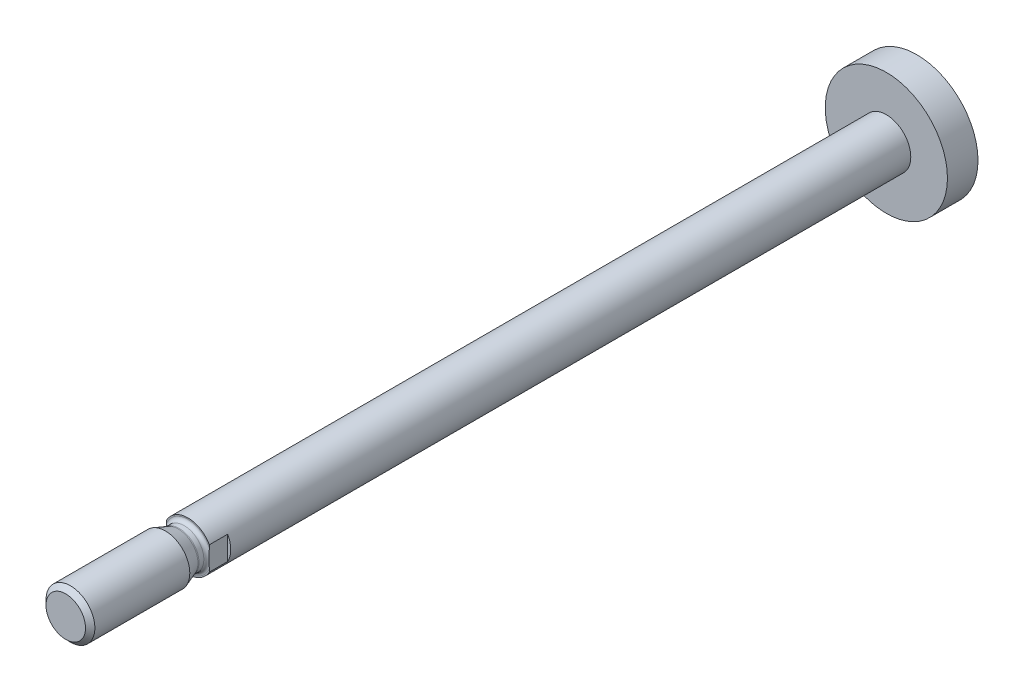
ISO-10303-21;
HEADER;
FILE_DESCRIPTION(('STEP AP214'),'2;1');
FILE_NAME('part.step','',(''),(''),'','','');
FILE_SCHEMA(('AUTOMOTIVE_DESIGN { 1 0 10303 214 1 1 1 1 }'));
ENDSEC;
DATA;
#1=APPLICATION_CONTEXT('core data for automotive mechanical design processes');
#2=APPLICATION_PROTOCOL_DEFINITION('international standard','automotive_design',2000,#1);
#3=PRODUCT_CONTEXT('',#1,'mechanical');
#4=PRODUCT('Part','Part','',(#3));
#5=PRODUCT_RELATED_PRODUCT_CATEGORY('part','',(#4));
#6=PRODUCT_DEFINITION_FORMATION('','',#4);
#7=PRODUCT_DEFINITION_CONTEXT('part definition',#1,'design');
#8=PRODUCT_DEFINITION('design','',#6,#7);
#9=PRODUCT_DEFINITION_SHAPE('','',#8);
#10=(LENGTH_UNIT() NAMED_UNIT(*) SI_UNIT(.MILLI.,.METRE.));
#11=(NAMED_UNIT(*) PLANE_ANGLE_UNIT() SI_UNIT($,.RADIAN.));
#12=(NAMED_UNIT(*) SI_UNIT($,.STERADIAN.) SOLID_ANGLE_UNIT());
#13=UNCERTAINTY_MEASURE_WITH_UNIT(LENGTH_MEASURE(1.E-05),#10,'distance_accuracy_value','');
#14=(GEOMETRIC_REPRESENTATION_CONTEXT(3) GLOBAL_UNCERTAINTY_ASSIGNED_CONTEXT((#13)) GLOBAL_UNIT_ASSIGNED_CONTEXT((#10,
#11,#12)) REPRESENTATION_CONTEXT('',''));
#15=CARTESIAN_POINT('',(0.,0.,0.));
#16=DIRECTION('',(0.,0.,1.));
#17=DIRECTION('',(1.,0.,0.));
#18=AXIS2_PLACEMENT_3D('',#15,#16,#17);
#19=CARTESIAN_POINT('',(0.,0.,4.));
#20=DIRECTION('',(0.,0.,-1.));
#21=DIRECTION('',(-1.,0.,0.));
#22=AXIS2_PLACEMENT_3D('',#19,#20,#21);
#23=PLANE('',#22);
#24=DIRECTION('',(0.,1.,0.));
#25=VECTOR('',#24,1.);
#26=CARTESIAN_POINT('',(-3.5,0.,4.));
#27=LINE('',#26,#25);
#28=CARTESIAN_POINT('',(-3.5,-1.93649167310371,4.));
#29=VERTEX_POINT('',#28);
#30=CARTESIAN_POINT('',(-3.5,-1.47986485869513,4.));
#31=VERTEX_POINT('',#30);
#32=EDGE_CURVE('E54',#29,#31,#27,.T.);
#33=ORIENTED_EDGE('',*,*,#32,.F.);
#34=CARTESIAN_POINT('',(0.,0.,4.));
#35=DIRECTION('',(0.,0.,1.));
#36=DIRECTION('',(1.,0.,0.));
#37=AXIS2_PLACEMENT_3D('',#34,#35,#36);
#38=CIRCLE('',#37,4.);
#39=CARTESIAN_POINT('',(3.5,-1.93649167310371,4.));
#40=VERTEX_POINT('',#39);
#41=EDGE_CURVE('E147',#29,#40,#38,.T.);
#42=ORIENTED_EDGE('',*,*,#41,.T.);
#43=DIRECTION('',(0.,-1.,0.));
#44=VECTOR('',#43,1.);
#45=CARTESIAN_POINT('',(3.5,0.,4.));
#46=LINE('',#45,#44);
#47=CARTESIAN_POINT('',(3.5,-1.47986485869513,3.99999999999992));
#48=VERTEX_POINT('',#47);
#49=EDGE_CURVE('E101',#48,#40,#46,.T.);
#50=ORIENTED_EDGE('',*,*,#49,.F.);
#51=CARTESIAN_POINT('',(0.,0.,4.));
#52=DIRECTION('',(0.,0.,1.));
#53=DIRECTION('',(1.,0.,0.));
#54=AXIS2_PLACEMENT_3D('',#51,#52,#53);
#55=CIRCLE('',#54,3.8000000000001);
#56=EDGE_CURVE('E149',#31,#48,#55,.T.);
#57=ORIENTED_EDGE('',*,*,#56,.F.);
#58=EDGE_LOOP('',(#33,#42,#50,#57));
#59=FACE_BOUND('',#58,.T.);
#60=ADVANCED_FACE('F40',(#59),#23,.F.);
#61=CARTESIAN_POINT('',(-3.5,1.47986485869513,3.99999999999992));
#62=VERTEX_POINT('',#61);
#63=CARTESIAN_POINT('',(-3.5,1.93649167310371,4.));
#64=VERTEX_POINT('',#63);
#65=EDGE_CURVE('E110',#62,#64,#27,.T.);
#66=ORIENTED_EDGE('',*,*,#65,.F.);
#67=CARTESIAN_POINT('',(3.5,1.47986485869513,4.));
#68=VERTEX_POINT('',#67);
#69=EDGE_CURVE('E150',#68,#62,#55,.T.);
#70=ORIENTED_EDGE('',*,*,#69,.F.);
#71=CARTESIAN_POINT('',(3.5,1.93649167310371,4.));
#72=VERTEX_POINT('',#71);
#73=EDGE_CURVE('E62',#72,#68,#46,.T.);
#74=ORIENTED_EDGE('',*,*,#73,.F.);
#75=EDGE_CURVE('E109',#72,#64,#38,.T.);
#76=ORIENTED_EDGE('',*,*,#75,.T.);
#77=EDGE_LOOP('',(#66,#70,#74,#76));
#78=FACE_BOUND('',#77,.T.);
#79=ADVANCED_FACE('F206',(#78),#23,.F.);
#80=CARTESIAN_POINT('',(0.,0.,-115.3));
#81=DIRECTION('',(0.,0.,1.));
#82=DIRECTION('',(1.,0.,0.));
#83=AXIS2_PLACEMENT_3D('',#80,#81,#82);
#84=CYLINDRICAL_SURFACE('',#83,4.);
#85=CARTESIAN_POINT('',(0.,0.,-110.3));
#86=DIRECTION('',(0.,0.,1.));
#87=DIRECTION('',(1.,0.,0.));
#88=AXIS2_PLACEMENT_3D('',#85,#86,#87);
#89=CIRCLE('',#88,4.);
#90=CARTESIAN_POINT('',(4.,0.,-110.3));
#91=VERTEX_POINT('',#90);
#92=EDGE_CURVE('E144',#91,#91,#89,.T.);
#93=ORIENTED_EDGE('',*,*,#92,.T.);
#94=EDGE_LOOP('',(#93));
#95=FACE_BOUND('',#94,.T.);
#96=DIRECTION('',(0.,0.,1.));
#97=VECTOR('',#96,1.);
#98=CARTESIAN_POINT('',(-3.5,-1.93649167310371,-115.3));
#99=LINE('',#98,#97);
#100=CARTESIAN_POINT('',(-3.5,-1.93649167310371,1.));
#101=VERTEX_POINT('',#100);
#102=EDGE_CURVE('E118',#101,#29,#99,.T.);
#103=ORIENTED_EDGE('',*,*,#102,.F.);
#104=CARTESIAN_POINT('',(0.,0.,1.));
#105=DIRECTION('',(0.,0.,1.));
#106=DIRECTION('',(1.,0.,0.));
#107=AXIS2_PLACEMENT_3D('',#104,#105,#106);
#108=CIRCLE('',#107,4.);
#109=CARTESIAN_POINT('',(-3.5,1.93649167310371,1.));
#110=VERTEX_POINT('',#109);
#111=EDGE_CURVE('E11',#110,#101,#108,.T.);
#112=ORIENTED_EDGE('',*,*,#111,.F.);
#113=DIRECTION('',(0.,0.,1.));
#114=VECTOR('',#113,1.);
#115=CARTESIAN_POINT('',(-3.5,1.93649167310371,-115.3));
#116=LINE('',#115,#114);
#117=EDGE_CURVE('E116',#64,#110,#116,.F.);
#118=ORIENTED_EDGE('',*,*,#117,.F.);
#119=ORIENTED_EDGE('',*,*,#75,.F.);
#120=DIRECTION('',(0.,0.,1.));
#121=VECTOR('',#120,1.);
#122=CARTESIAN_POINT('',(3.5,1.93649167310371,-115.3));
#123=LINE('',#122,#121);
#124=CARTESIAN_POINT('',(3.5,1.93649167310371,1.));
#125=VERTEX_POINT('',#124);
#126=EDGE_CURVE('E99',#125,#72,#123,.T.);
#127=ORIENTED_EDGE('',*,*,#126,.F.);
#128=CARTESIAN_POINT('',(3.5,-1.93649167310371,1.));
#129=VERTEX_POINT('',#128);
#130=EDGE_CURVE('E43',#129,#125,#108,.T.);
#131=ORIENTED_EDGE('',*,*,#130,.F.);
#132=DIRECTION('',(0.,0.,1.));
#133=VECTOR('',#132,1.);
#134=CARTESIAN_POINT('',(3.5,-1.93649167310371,-115.3));
#135=LINE('',#134,#133);
#136=EDGE_CURVE('E100',#40,#129,#135,.F.);
#137=ORIENTED_EDGE('',*,*,#136,.F.);
#138=ORIENTED_EDGE('',*,*,#41,.F.);
#139=EDGE_LOOP('',(#103,#112,#118,#119,#127,#131,#137,#138));
#140=FACE_BOUND('',#139,.T.);
#141=ADVANCED_FACE('F106',(#95,#140),#84,.T.);
#142=CARTESIAN_POINT('',(0.,0.,4.6000000000001));
#143=DIRECTION('',(0.,0.,1.));
#144=DIRECTION('',(1.,0.,0.));
#145=AXIS2_PLACEMENT_3D('',#142,#143,#144);
#146=TOROIDAL_SURFACE('',#145,3.8000000000001,0.600000000000099);
#147=CARTESIAN_POINT('',(0.,0.,4.6));
#148=DIRECTION('',(0.,0.,1.));
#149=DIRECTION('',(1.,0.,0.));
#150=AXIS2_PLACEMENT_3D('',#147,#148,#149);
#151=CIRCLE('',#150,3.2);
#152=CARTESIAN_POINT('',(3.2,0.,4.6));
#153=VERTEX_POINT('',#152);
#154=EDGE_CURVE('E135',#153,#153,#151,.T.);
#155=ORIENTED_EDGE('',*,*,#154,.F.);
#156=EDGE_LOOP('',(#155));
#157=FACE_BOUND('',#156,.T.);
#158=CARTESIAN_POINT('',(-3.5,0.,4.08038475772938));
#159=CARTESIAN_POINT('',(-3.5,0.0500062055653644,4.08038579524003));
#160=CARTESIAN_POINT('',(-3.5,0.10001186907905,4.07976142660828));
#161=CARTESIAN_POINT('',(-3.5,0.200008073579427,4.07732415974821));
#162=CARTESIAN_POINT('',(-3.5,0.249998606009498,4.07551091782565));
#163=CARTESIAN_POINT('',(-3.5,0.350023676666661,4.0708553451476));
#164=CARTESIAN_POINT('',(-3.5,0.400058122823757,4.06801109956585));
#165=CARTESIAN_POINT('',(-3.5,0.500067954430721,4.06154909714063));
#166=CARTESIAN_POINT('',(-3.5,0.550043347826766,4.05793146015032));
#167=CARTESIAN_POINT('',(-3.5,0.690839508563253,4.04708094798961));
#168=CARTESIAN_POINT('',(-3.5,0.781617050076563,4.03931230060361));
#169=CARTESIAN_POINT('',(-3.5,0.9632220149238,4.024401341373));
#170=CARTESIAN_POINT('',(-3.5,1.05404943604569,4.01725900370584));
#171=CARTESIAN_POINT('',(-3.5,1.2359337458161,4.00596554667804));
#172=CARTESIAN_POINT('',(-3.5,1.32699066193964,4.00181480438343));
#173=CARTESIAN_POINT('',(-3.5,1.50913050906379,3.99911696420226));
#174=CARTESIAN_POINT('',(-3.5,1.60021331380939,4.00056402453771));
#175=CARTESIAN_POINT('',(-3.5,1.7832512039485,4.01223826838346));
#176=CARTESIAN_POINT('',(-3.5,1.87520111900955,4.02258560378902));
#177=CARTESIAN_POINT('',(-3.5,2.01109807868235,4.04805353771768));
#178=CARTESIAN_POINT('',(-3.5,2.05597275422268,4.05817105079477));
#179=CARTESIAN_POINT('',(-3.5,2.1446015872334,4.08243134215497));
#180=CARTESIAN_POINT('',(-3.5,2.18835703510382,4.09656923395692));
#181=CARTESIAN_POINT('',(-3.5,2.26502423932735,4.12625619760487));
#182=CARTESIAN_POINT('',(-3.5,2.29828717281195,4.14088897580844));
#183=CARTESIAN_POINT('',(-3.5,2.36308366134456,4.17374487362841));
#184=CARTESIAN_POINT('',(-3.5,2.39461486317948,4.1919727313804));
#185=CARTESIAN_POINT('',(-3.5,2.45528633475527,4.2327718563323));
#186=CARTESIAN_POINT('',(-3.5,2.48439672100251,4.25538839857406));
#187=CARTESIAN_POINT('',(-3.5,2.53828325245288,4.30531204058377));
#188=CARTESIAN_POINT('',(-3.5,2.56307231252292,4.33260466298422));
#189=CARTESIAN_POINT('',(-3.5,2.59835539678092,4.38117119923997));
#190=CARTESIAN_POINT('',(-3.5,2.61077480767077,4.40104374871059));
#191=CARTESIAN_POINT('',(-3.5,2.63229473049418,4.44252572441527));
#192=CARTESIAN_POINT('',(-3.5,2.64139766596252,4.4641338682032));
#193=CARTESIAN_POINT('',(-3.5,2.6556780834849,4.50882581532605));
#194=CARTESIAN_POINT('',(-3.5,2.66082330977963,4.53192011572204));
#195=CARTESIAN_POINT('',(-3.5,2.66658722454624,4.57866774033149));
#196=CARTESIAN_POINT('',(-3.5,2.66720861100635,4.60232072290385));
#197=CARTESIAN_POINT('',(-3.5,2.66406334493496,4.64664399355305));
#198=CARTESIAN_POINT('',(-3.5,2.66078189261244,4.66735080097796));
#199=CARTESIAN_POINT('',(-3.5,2.65086769882215,4.70793958933708));
#200=CARTESIAN_POINT('',(-3.5,2.64423425840105,4.72782139730718));
#201=CARTESIAN_POINT('',(-3.5,2.62783818542989,4.76683694228269));
#202=CARTESIAN_POINT('',(-3.5,2.61799948146632,4.78593830149638));
#203=CARTESIAN_POINT('',(-3.5,2.5957864239932,4.8225893297694));
#204=CARTESIAN_POINT('',(-3.5,2.58341098566742,4.84013833036213));
#205=CARTESIAN_POINT('',(-3.5,2.54827666077279,4.88403391197271));
#206=CARTESIAN_POINT('',(-3.5,2.52385245228452,4.90904933157706));
#207=CARTESIAN_POINT('',(-3.5,2.4713802477796,4.95494570673838));
#208=CARTESIAN_POINT('',(-3.5,2.44332184293567,4.97581433256553));
#209=CARTESIAN_POINT('',(-3.5,2.36690919769617,5.02546583684508));
#210=CARTESIAN_POINT('',(-3.5,2.31664003371327,5.05127975894021));
#211=CARTESIAN_POINT('',(-3.5,2.21292774859494,5.09519868885441));
#212=CARTESIAN_POINT('',(-3.5,2.15947928807564,5.11329028588226));
#213=CARTESIAN_POINT('',(-3.5,2.05241854459677,5.14298422713627));
#214=CARTESIAN_POINT('',(-3.5,1.99885008338122,5.15474937556394));
#215=CARTESIAN_POINT('',(-3.5,1.89088555933464,5.17371645891197));
#216=CARTESIAN_POINT('',(-3.5,1.83648865462849,5.18091338377391));
#217=CARTESIAN_POINT('',(-3.5,1.72719420827212,5.19169636188153));
#218=CARTESIAN_POINT('',(-3.5,1.67229565989963,5.19527163434467));
#219=CARTESIAN_POINT('',(-3.5,1.56237784754192,5.19956192851468));
#220=CARTESIAN_POINT('',(-3.5,1.50735854591716,5.20027587383621));
#221=CARTESIAN_POINT('',(-3.5,1.32143089044828,5.19902509431349));
#222=CARTESIAN_POINT('',(-3.5,1.19058803810505,5.1920033327333));
#223=CARTESIAN_POINT('',(-3.5,0.929144323978893,5.17339442832176));
#224=CARTESIAN_POINT('',(-3.5,0.798544182549121,5.161800011167));
#225=CARTESIAN_POINT('',(-3.5,0.602747235241971,5.14602809613734));
#226=CARTESIAN_POINT('',(-3.5,0.537627510492783,5.14104900273235));
#227=CARTESIAN_POINT('',(-3.5,0.407306821786678,5.1323371224062));
#228=CARTESIAN_POINT('',(-3.5,0.342105863988336,5.1286042461649));
#229=CARTESIAN_POINT('',(-3.5,0.211728862091437,5.1229526202353));
#230=CARTESIAN_POINT('',(-3.5,0.146552955128154,5.1210308804655));
#231=CARTESIAN_POINT('',(-3.5,0.0161730194372509,5.11928917221939));
#232=CARTESIAN_POINT('',(-3.5,-0.0490310086083378,5.11946915535245));
#233=CARTESIAN_POINT('',(-3.5,-0.179475576502579,5.12190517622444));
#234=CARTESIAN_POINT('',(-3.5,-0.244716066981349,5.12416369265122));
#235=CARTESIAN_POINT('',(-3.5,-0.375115910587606,5.13040554579892));
#236=CARTESIAN_POINT('',(-3.5,-0.440275258610719,5.13438898602551));
#237=CARTESIAN_POINT('',(-3.5,-0.635895337566246,5.14807827632179));
#238=CARTESIAN_POINT('',(-3.5,-0.76621884732944,5.15951342405818));
#239=CARTESIAN_POINT('',(-3.5,-1.02713131334285,5.18073972163101));
#240=CARTESIAN_POINT('',(-3.5,-1.15772038871775,5.19052976890211));
#241=CARTESIAN_POINT('',(-3.5,-1.35378409785631,5.19852164600105));
#242=CARTESIAN_POINT('',(-3.5,-1.41909161309346,5.2000721709194));
#243=CARTESIAN_POINT('',(-3.5,-1.54969188303483,5.19992263560432));
#244=CARTESIAN_POINT('',(-3.5,-1.61498463760302,5.19822333879744));
#245=CARTESIAN_POINT('',(-3.5,-1.76029290673312,5.18951322581212));
#246=CARTESIAN_POINT('',(-3.5,-1.84025983788535,5.18137635704226));
#247=CARTESIAN_POINT('',(-3.5,-1.95903476517147,5.16210189637695));
#248=CARTESIAN_POINT('',(-3.5,-1.99841540324246,5.15450321251105));
#249=CARTESIAN_POINT('',(-3.5,-2.07652038986955,5.13650653853808));
#250=CARTESIAN_POINT('',(-3.5,-2.11524511477409,5.12611021577707));
#251=CARTESIAN_POINT('',(-3.5,-2.19864889359521,5.0998048910277));
#252=CARTESIAN_POINT('',(-3.5,-2.24312539757502,5.08323620538603));
#253=CARTESIAN_POINT('',(-3.5,-2.32958676042036,5.04443385186534));
#254=CARTESIAN_POINT('',(-3.5,-2.37157403081922,5.022205781053));
#255=CARTESIAN_POINT('',(-3.5,-2.43977528813279,4.97826900973618));
#256=CARTESIAN_POINT('',(-3.5,-2.46706045695041,4.95823818276675));
#257=CARTESIAN_POINT('',(-3.5,-2.51831793755153,4.91428859212922));
#258=CARTESIAN_POINT('',(-3.5,-2.54229604965639,4.89037680000235));
#259=CARTESIAN_POINT('',(-3.5,-2.57970363739195,4.84535217347594));
#260=CARTESIAN_POINT('',(-3.5,-2.59424612037896,4.82517000607983));
#261=CARTESIAN_POINT('',(-3.5,-2.61992505476884,4.78272143024207));
#262=CARTESIAN_POINT('',(-3.5,-2.63106349643882,4.76045624967719));
#263=CARTESIAN_POINT('',(-3.5,-2.64920025698533,4.7140036601898));
#264=CARTESIAN_POINT('',(-3.5,-2.65615513895816,4.68979894460471));
#265=CARTESIAN_POINT('',(-3.5,-2.66504809529779,4.64048613942947));
#266=CARTESIAN_POINT('',(-3.5,-2.66699167521719,4.61537907197386));
#267=CARTESIAN_POINT('',(-3.5,-2.66576972792539,4.56913838413921));
#268=CARTESIAN_POINT('',(-3.5,-2.66333713024049,4.54798188760978));
#269=CARTESIAN_POINT('',(-3.5,-2.65493122425014,4.50638930411087));
#270=CARTESIAN_POINT('',(-3.5,-2.6489573784939,4.4859533269926));
#271=CARTESIAN_POINT('',(-3.5,-2.63391040496586,4.44635032544822));
#272=CARTESIAN_POINT('',(-3.5,-2.62484735225162,4.42717941476791));
#273=CARTESIAN_POINT('',(-3.5,-2.60412982714912,4.39030840624931));
#274=CARTESIAN_POINT('',(-3.5,-2.59247439145874,4.37260885852133));
#275=CARTESIAN_POINT('',(-3.5,-2.55964651342061,4.32891810073296));
#276=CARTESIAN_POINT('',(-3.5,-2.53688962871665,4.30411605633953));
#277=CARTESIAN_POINT('',(-3.5,-2.48775025498198,4.25840323881892));
#278=CARTESIAN_POINT('',(-3.5,-2.46135776993871,4.2375035818933));
#279=CARTESIAN_POINT('',(-3.5,-2.38986954756856,4.18798307162582));
#280=CARTESIAN_POINT('',(-3.5,-2.34291429622141,4.16206577415089));
#281=CARTESIAN_POINT('',(-3.5,-2.24574558542675,4.11749887118979));
#282=CARTESIAN_POINT('',(-3.5,-2.19552624943271,4.09886282247383));
#283=CARTESIAN_POINT('',(-3.5,-2.09587462128469,4.06817578766957));
#284=CARTESIAN_POINT('',(-3.5,-2.04652620992952,4.05584474254379));
#285=CARTESIAN_POINT('',(-3.5,-1.94693895896851,4.0354159388682));
#286=CARTESIAN_POINT('',(-3.5,-1.89669924688715,4.02732259522156));
#287=CARTESIAN_POINT('',(-3.5,-1.74513146101115,4.00812320842939));
#288=CARTESIAN_POINT('',(-3.5,-1.64316995649346,4.00215511449531));
#289=CARTESIAN_POINT('',(-3.5,-1.41246700498561,3.99839333626015));
#290=CARTESIAN_POINT('',(-3.5,-1.28373629994329,4.00316287285656));
#291=CARTESIAN_POINT('',(-3.5,-1.02661753839385,4.01880990476259));
#292=CARTESIAN_POINT('',(-3.5,-0.898230000845064,4.0296939787844));
#293=CARTESIAN_POINT('',(-3.5,-0.705746127745405,4.04568170858882));
#294=CARTESIAN_POINT('',(-3.5,-0.641662853121003,4.05094963535158));
#295=CARTESIAN_POINT('',(-3.5,-0.513433811524688,4.06064102594273));
#296=CARTESIAN_POINT('',(-3.5,-0.449288049445188,4.06506455125933));
#297=CARTESIAN_POINT('',(-3.5,-0.32098353941607,4.07243012154035));
#298=CARTESIAN_POINT('',(-3.5,-0.256824896504214,4.07537391204972));
#299=CARTESIAN_POINT('',(-3.5,-0.128443871708583,4.07935057895739));
#300=CARTESIAN_POINT('',(-3.5,-0.0642214888377097,4.08038342528518));
#301=CARTESIAN_POINT('',(-3.5,0.,4.08038475772938));
#302=B_SPLINE_CURVE_WITH_KNOTS('',3,(#158,#159,#160,#161,#162,#163,#164,#165,#166,#167,#168,
#169,#170,#171,#172,#173,#174,#175,#176,#177,#178,#179,#180,#181,#182,#183,#184,#185,#186,#187,
#188,#189,#190,#191,#192,#193,#194,#195,#196,#197,#198,#199,#200,#201,#202,#203,#204,#205,#206,
#207,#208,#209,#210,#211,#212,#213,#214,#215,#216,#217,#218,#219,#220,#221,#222,#223,#224,#225,
#226,#227,#228,#229,#230,#231,#232,#233,#234,#235,#236,#237,#238,#239,#240,#241,#242,#243,#244,
#245,#246,#247,#248,#249,#250,#251,#252,#253,#254,#255,#256,#257,#258,#259,#260,#261,#262,#263,
#264,#265,#266,#267,#268,#269,#270,#271,#272,#273,#274,#275,#276,#277,#278,#279,#280,#281,#282,
#283,#284,#285,#286,#287,#288,#289,#290,#291,#292,#293,#294,#295,#296,#297,#298,#299,#300,#301),
.UNSPECIFIED.,.T.,.F.,(4,2,2,2,2,2,2,2,2,2,2,2,2,2,2,2,2,2,2,2,2,2,2,2,2,2,2,2,2,2,2,2,2,2,2,2,
2,2,2,2,2,2,2,2,2,2,2,2,2,2,2,2,2,2,2,2,2,2,2,2,2,2,2,2,2,2,2,2,2,2,2,4),(0.,0.150014048798422,
0.300071484653546,0.450409053935331,0.600723342136289,0.874049825720873,1.14736503484109,
1.42071468707779,1.69377915294987,1.97058884479861,2.10845216776641,2.2461486387614,
2.35499514952082,2.46398608488314,2.57416771557531,2.68401418736232,2.75406745328572,
2.8240694241867,2.89463604494047,2.96516057677686,3.02776088906933,3.09037426010844,
3.15459752456243,3.21884831114799,3.32313116232507,3.42771958650061,3.59629393435684,
3.76515985338398,3.92944239010749,4.09390478874738,4.25885532608726,4.42386790935157,
4.81662747336841,5.21001438834882,5.4059342565683,5.60184007960282,5.79742190395237,
5.99299922518425,6.18881007848093,6.38463268321895,6.77711538137523,7.16986008579766,
7.36577121673005,7.56163633117303,7.80230390131153,7.92254416345271,8.04271292251144,
8.18480424522089,8.32675558344215,8.42801297124486,8.5290904393555,8.60345225460728,
8.67777050861516,8.75284763934138,8.82784225307812,8.89141694017011,8.95500127838402,
9.01838019760285,9.08178270722154,9.1821864562108,9.28287198824411,9.44286612854139,
9.60315675421254,9.75552106026109,9.90804378754775,10.2137509318015,10.5998737561413,
10.9864128129893,11.1793105025674,11.372194140224,11.5648497087301,11.7575083088275),.UNSPECIFIED.);
#303=EDGE_CURVE('E97',#31,#62,#302,.T.);
#304=ORIENTED_EDGE('',*,*,#303,.F.);
#305=ORIENTED_EDGE('',*,*,#56,.T.);
#306=CARTESIAN_POINT('',(3.5,0.,4.08038475772938));
#307=CARTESIAN_POINT('',(3.5,-0.0500062055653644,4.08038579524003));
#308=CARTESIAN_POINT('',(3.5,-0.10001186907905,4.07976142660828));
#309=CARTESIAN_POINT('',(3.5,-0.200008073579427,4.07732415974821));
#310=CARTESIAN_POINT('',(3.5,-0.249998606009498,4.07551091782565));
#311=CARTESIAN_POINT('',(3.5,-0.350023676666661,4.0708553451476));
#312=CARTESIAN_POINT('',(3.5,-0.400058122823757,4.06801109956585));
#313=CARTESIAN_POINT('',(3.5,-0.500067954430721,4.06154909714063));
#314=CARTESIAN_POINT('',(3.5,-0.550043347826766,4.05793146015032));
#315=CARTESIAN_POINT('',(3.5,-0.690839508563253,4.04708094798961));
#316=CARTESIAN_POINT('',(3.5,-0.781617050076563,4.03931230060361));
#317=CARTESIAN_POINT('',(3.5,-0.9632220149238,4.024401341373));
#318=CARTESIAN_POINT('',(3.5,-1.05404943604569,4.01725900370584));
#319=CARTESIAN_POINT('',(3.5,-1.2359337458161,4.00596554667804));
#320=CARTESIAN_POINT('',(3.5,-1.32699066193964,4.00181480438343));
#321=CARTESIAN_POINT('',(3.5,-1.50913050906379,3.99911696420226));
#322=CARTESIAN_POINT('',(3.5,-1.60021331380939,4.00056402453771));
#323=CARTESIAN_POINT('',(3.5,-1.7832512039485,4.01223826838346));
#324=CARTESIAN_POINT('',(3.5,-1.87520111900955,4.02258560378902));
#325=CARTESIAN_POINT('',(3.5,-2.01109807868235,4.04805353771768));
#326=CARTESIAN_POINT('',(3.5,-2.05597275422268,4.05817105079477));
#327=CARTESIAN_POINT('',(3.5,-2.1446015872334,4.08243134215497));
#328=CARTESIAN_POINT('',(3.5,-2.18835703510382,4.09656923395692));
#329=CARTESIAN_POINT('',(3.5,-2.26502423932735,4.12625619760487));
#330=CARTESIAN_POINT('',(3.5,-2.29828717281195,4.14088897580844));
#331=CARTESIAN_POINT('',(3.5,-2.36308366134456,4.17374487362841));
#332=CARTESIAN_POINT('',(3.5,-2.39461486317948,4.1919727313804));
#333=CARTESIAN_POINT('',(3.5,-2.45528633475527,4.2327718563323));
#334=CARTESIAN_POINT('',(3.5,-2.48439672100251,4.25538839857406));
#335=CARTESIAN_POINT('',(3.5,-2.53828325245288,4.30531204058377));
#336=CARTESIAN_POINT('',(3.5,-2.56307231252292,4.33260466298422));
#337=CARTESIAN_POINT('',(3.5,-2.59835539678092,4.38117119923997));
#338=CARTESIAN_POINT('',(3.5,-2.61077480767077,4.40104374871059));
#339=CARTESIAN_POINT('',(3.5,-2.63229473049418,4.44252572441527));
#340=CARTESIAN_POINT('',(3.5,-2.64139766596252,4.4641338682032));
#341=CARTESIAN_POINT('',(3.5,-2.6556780834849,4.50882581532605));
#342=CARTESIAN_POINT('',(3.5,-2.66082330977963,4.53192011572204));
#343=CARTESIAN_POINT('',(3.5,-2.66658722454624,4.57866774033149));
#344=CARTESIAN_POINT('',(3.5,-2.66720861100635,4.60232072290385));
#345=CARTESIAN_POINT('',(3.5,-2.66406334493496,4.64664399355305));
#346=CARTESIAN_POINT('',(3.5,-2.66078189261244,4.66735080097796));
#347=CARTESIAN_POINT('',(3.5,-2.65086769882215,4.70793958933708));
#348=CARTESIAN_POINT('',(3.5,-2.64423425840105,4.72782139730718));
#349=CARTESIAN_POINT('',(3.5,-2.62783818542989,4.76683694228269));
#350=CARTESIAN_POINT('',(3.5,-2.61799948146632,4.78593830149638));
#351=CARTESIAN_POINT('',(3.5,-2.5957864239932,4.8225893297694));
#352=CARTESIAN_POINT('',(3.5,-2.58341098566742,4.84013833036213));
#353=CARTESIAN_POINT('',(3.5,-2.54827666077279,4.88403391197271));
#354=CARTESIAN_POINT('',(3.5,-2.52385245228452,4.90904933157706));
#355=CARTESIAN_POINT('',(3.5,-2.4713802477796,4.95494570673838));
#356=CARTESIAN_POINT('',(3.5,-2.44332184293567,4.97581433256553));
#357=CARTESIAN_POINT('',(3.5,-2.36690919769617,5.02546583684508));
#358=CARTESIAN_POINT('',(3.5,-2.31664003371327,5.05127975894021));
#359=CARTESIAN_POINT('',(3.5,-2.21292774859494,5.09519868885441));
#360=CARTESIAN_POINT('',(3.5,-2.15947928807564,5.11329028588226));
#361=CARTESIAN_POINT('',(3.5,-2.05241854459677,5.14298422713627));
#362=CARTESIAN_POINT('',(3.5,-1.99885008338122,5.15474937556394));
#363=CARTESIAN_POINT('',(3.5,-1.89088555933464,5.17371645891197));
#364=CARTESIAN_POINT('',(3.5,-1.83648865462849,5.18091338377391));
#365=CARTESIAN_POINT('',(3.5,-1.72719420827212,5.19169636188153));
#366=CARTESIAN_POINT('',(3.5,-1.67229565989963,5.19527163434467));
#367=CARTESIAN_POINT('',(3.5,-1.56237784754192,5.19956192851468));
#368=CARTESIAN_POINT('',(3.5,-1.50735854591716,5.20027587383621));
#369=CARTESIAN_POINT('',(3.5,-1.32143089044828,5.19902509431349));
#370=CARTESIAN_POINT('',(3.5,-1.19058803810505,5.1920033327333));
#371=CARTESIAN_POINT('',(3.5,-0.929144323978893,5.17339442832176));
#372=CARTESIAN_POINT('',(3.5,-0.798544182549121,5.161800011167));
#373=CARTESIAN_POINT('',(3.5,-0.602747235241971,5.14602809613734));
#374=CARTESIAN_POINT('',(3.5,-0.537627510492783,5.14104900273235));
#375=CARTESIAN_POINT('',(3.5,-0.407306821786678,5.1323371224062));
#376=CARTESIAN_POINT('',(3.5,-0.342105863988336,5.1286042461649));
#377=CARTESIAN_POINT('',(3.5,-0.211728862091437,5.1229526202353));
#378=CARTESIAN_POINT('',(3.5,-0.146552955128154,5.1210308804655));
#379=CARTESIAN_POINT('',(3.5,-0.0161730194372509,5.11928917221939));
#380=CARTESIAN_POINT('',(3.5,0.0490310086083378,5.11946915535245));
#381=CARTESIAN_POINT('',(3.5,0.179475576502579,5.12190517622444));
#382=CARTESIAN_POINT('',(3.5,0.244716066981349,5.12416369265122));
#383=CARTESIAN_POINT('',(3.5,0.375115910587606,5.13040554579892));
#384=CARTESIAN_POINT('',(3.5,0.440275258610719,5.13438898602551));
#385=CARTESIAN_POINT('',(3.5,0.635895337566246,5.14807827632179));
#386=CARTESIAN_POINT('',(3.5,0.76621884732944,5.15951342405818));
#387=CARTESIAN_POINT('',(3.5,1.02713131334285,5.18073972163101));
#388=CARTESIAN_POINT('',(3.5,1.15772038871775,5.19052976890211));
#389=CARTESIAN_POINT('',(3.5,1.35378409785631,5.19852164600105));
#390=CARTESIAN_POINT('',(3.5,1.41909161309346,5.2000721709194));
#391=CARTESIAN_POINT('',(3.5,1.54969188303483,5.19992263560432));
#392=CARTESIAN_POINT('',(3.5,1.61498463760302,5.19822333879744));
#393=CARTESIAN_POINT('',(3.5,1.76029290673312,5.18951322581212));
#394=CARTESIAN_POINT('',(3.5,1.84025983788535,5.18137635704226));
#395=CARTESIAN_POINT('',(3.5,1.95903476517147,5.16210189637695));
#396=CARTESIAN_POINT('',(3.5,1.99841540324246,5.15450321251105));
#397=CARTESIAN_POINT('',(3.5,2.07652038986955,5.13650653853808));
#398=CARTESIAN_POINT('',(3.5,2.11524511477409,5.12611021577707));
#399=CARTESIAN_POINT('',(3.5,2.19864889359521,5.0998048910277));
#400=CARTESIAN_POINT('',(3.5,2.24312539757502,5.08323620538603));
#401=CARTESIAN_POINT('',(3.5,2.32958676042036,5.04443385186534));
#402=CARTESIAN_POINT('',(3.5,2.37157403081922,5.022205781053));
#403=CARTESIAN_POINT('',(3.5,2.43977528813279,4.97826900973618));
#404=CARTESIAN_POINT('',(3.5,2.46706045695041,4.95823818276675));
#405=CARTESIAN_POINT('',(3.5,2.51831793755153,4.91428859212922));
#406=CARTESIAN_POINT('',(3.5,2.54229604965639,4.89037680000235));
#407=CARTESIAN_POINT('',(3.5,2.57970363739195,4.84535217347594));
#408=CARTESIAN_POINT('',(3.5,2.59424612037896,4.82517000607983));
#409=CARTESIAN_POINT('',(3.5,2.61992505476884,4.78272143024207));
#410=CARTESIAN_POINT('',(3.5,2.63106349643882,4.76045624967719));
#411=CARTESIAN_POINT('',(3.5,2.64920025698533,4.7140036601898));
#412=CARTESIAN_POINT('',(3.5,2.65615513895816,4.68979894460471));
#413=CARTESIAN_POINT('',(3.5,2.66504809529779,4.64048613942947));
#414=CARTESIAN_POINT('',(3.5,2.66699167521719,4.61537907197386));
#415=CARTESIAN_POINT('',(3.5,2.66576972792539,4.56913838413921));
#416=CARTESIAN_POINT('',(3.5,2.66333713024049,4.54798188760978));
#417=CARTESIAN_POINT('',(3.5,2.65493122425014,4.50638930411087));
#418=CARTESIAN_POINT('',(3.5,2.6489573784939,4.4859533269926));
#419=CARTESIAN_POINT('',(3.5,2.63391040496586,4.44635032544822));
#420=CARTESIAN_POINT('',(3.5,2.62484735225162,4.42717941476791));
#421=CARTESIAN_POINT('',(3.5,2.60412982714912,4.39030840624931));
#422=CARTESIAN_POINT('',(3.5,2.59247439145874,4.37260885852133));
#423=CARTESIAN_POINT('',(3.5,2.55964651342061,4.32891810073296));
#424=CARTESIAN_POINT('',(3.5,2.53688962871665,4.30411605633953));
#425=CARTESIAN_POINT('',(3.5,2.48775025498198,4.25840323881892));
#426=CARTESIAN_POINT('',(3.5,2.46135776993871,4.2375035818933));
#427=CARTESIAN_POINT('',(3.5,2.38986954756856,4.18798307162582));
#428=CARTESIAN_POINT('',(3.5,2.34291429622141,4.16206577415089));
#429=CARTESIAN_POINT('',(3.5,2.24574558542675,4.11749887118979));
#430=CARTESIAN_POINT('',(3.5,2.19552624943271,4.09886282247383));
#431=CARTESIAN_POINT('',(3.5,2.09587462128469,4.06817578766957));
#432=CARTESIAN_POINT('',(3.5,2.04652620992952,4.05584474254379));
#433=CARTESIAN_POINT('',(3.5,1.94693895896851,4.0354159388682));
#434=CARTESIAN_POINT('',(3.5,1.89669924688715,4.02732259522156));
#435=CARTESIAN_POINT('',(3.5,1.74513146101115,4.00812320842939));
#436=CARTESIAN_POINT('',(3.5,1.64316995649346,4.00215511449531));
#437=CARTESIAN_POINT('',(3.5,1.41246700498561,3.99839333626015));
#438=CARTESIAN_POINT('',(3.5,1.28373629994329,4.00316287285656));
#439=CARTESIAN_POINT('',(3.5,1.02661753839385,4.01880990476259));
#440=CARTESIAN_POINT('',(3.5,0.898230000845064,4.0296939787844));
#441=CARTESIAN_POINT('',(3.5,0.705746127745405,4.04568170858882));
#442=CARTESIAN_POINT('',(3.5,0.641662853121003,4.05094963535158));
#443=CARTESIAN_POINT('',(3.5,0.513433811524688,4.06064102594273));
#444=CARTESIAN_POINT('',(3.5,0.449288049445188,4.06506455125933));
#445=CARTESIAN_POINT('',(3.5,0.32098353941607,4.07243012154035));
#446=CARTESIAN_POINT('',(3.5,0.256824896504214,4.07537391204972));
#447=CARTESIAN_POINT('',(3.5,0.128443871708583,4.07935057895739));
#448=CARTESIAN_POINT('',(3.5,0.0642214888377097,4.08038342528518));
#449=CARTESIAN_POINT('',(3.5,0.,4.08038475772938));
#450=B_SPLINE_CURVE_WITH_KNOTS('',3,(#306,#307,#308,#309,#310,#311,#312,#313,#314,#315,#316,
#317,#318,#319,#320,#321,#322,#323,#324,#325,#326,#327,#328,#329,#330,#331,#332,#333,#334,#335,
#336,#337,#338,#339,#340,#341,#342,#343,#344,#345,#346,#347,#348,#349,#350,#351,#352,#353,#354,
#355,#356,#357,#358,#359,#360,#361,#362,#363,#364,#365,#366,#367,#368,#369,#370,#371,#372,#373,
#374,#375,#376,#377,#378,#379,#380,#381,#382,#383,#384,#385,#386,#387,#388,#389,#390,#391,#392,
#393,#394,#395,#396,#397,#398,#399,#400,#401,#402,#403,#404,#405,#406,#407,#408,#409,#410,#411,
#412,#413,#414,#415,#416,#417,#418,#419,#420,#421,#422,#423,#424,#425,#426,#427,#428,#429,#430,
#431,#432,#433,#434,#435,#436,#437,#438,#439,#440,#441,#442,#443,#444,#445,#446,#447,#448,#449),
.UNSPECIFIED.,.T.,.F.,(4,2,2,2,2,2,2,2,2,2,2,2,2,2,2,2,2,2,2,2,2,2,2,2,2,2,2,2,2,2,2,2,2,2,2,2,
2,2,2,2,2,2,2,2,2,2,2,2,2,2,2,2,2,2,2,2,2,2,2,2,2,2,2,2,2,2,2,2,2,2,2,4),(0.,0.150014048798422,
0.300071484653546,0.450409053935331,0.600723342136289,0.874049825720873,1.14736503484109,
1.42071468707779,1.69377915294987,1.97058884479861,2.10845216776641,2.2461486387614,
2.35499514952082,2.46398608488314,2.57416771557531,2.68401418736232,2.75406745328572,
2.8240694241867,2.89463604494047,2.96516057677686,3.02776088906933,3.09037426010844,
3.15459752456243,3.21884831114799,3.32313116232507,3.42771958650061,3.59629393435684,
3.76515985338398,3.92944239010749,4.09390478874738,4.25885532608726,4.42386790935157,
4.81662747336841,5.21001438834882,5.4059342565683,5.60184007960282,5.79742190395237,
5.99299922518425,6.18881007848093,6.38463268321895,6.77711538137523,7.16986008579766,
7.36577121673005,7.56163633117303,7.80230390131153,7.92254416345271,8.04271292251144,
8.18480424522089,8.32675558344215,8.42801297124486,8.5290904393555,8.60345225460728,
8.67777050861516,8.75284763934138,8.82784225307812,8.89141694017011,8.95500127838402,
9.01838019760285,9.08178270722154,9.1821864562108,9.28287198824411,9.44286612854139,
9.60315675421254,9.75552106026109,9.90804378754775,10.2137509318015,10.5998737561413,
10.9864128129893,11.1793105025674,11.372194140224,11.5648497087301,11.7575083088275),.UNSPECIFIED.);
#451=EDGE_CURVE('E153',#68,#48,#450,.T.);
#452=ORIENTED_EDGE('',*,*,#451,.F.);
#453=ORIENTED_EDGE('',*,*,#69,.T.);
#454=EDGE_LOOP('',(#304,#305,#452,#453));
#455=FACE_BOUND('',#454,.T.);
#456=ADVANCED_FACE('F163',(#157,#455),#146,.F.);
#457=CARTESIAN_POINT('',(0.,4.,-110.3));
#458=DIRECTION('',(0.,0.,-1.));
#459=DIRECTION('',(-1.,0.,0.));
#460=AXIS2_PLACEMENT_3D('',#457,#458,#459);
#461=PLANE('',#460);
#462=ORIENTED_EDGE('',*,*,#92,.F.);
#463=EDGE_LOOP('',(#462));
#464=FACE_BOUND('',#463,.T.);
#465=CARTESIAN_POINT('',(0.,0.,-110.3));
#466=DIRECTION('',(0.,0.,1.));
#467=DIRECTION('',(1.,0.,0.));
#468=AXIS2_PLACEMENT_3D('',#465,#466,#467);
#469=CIRCLE('',#468,10.);
#470=CARTESIAN_POINT('',(10.,0.,-110.3));
#471=VERTEX_POINT('',#470);
#472=EDGE_CURVE('E141',#471,#471,#469,.T.);
#473=ORIENTED_EDGE('',*,*,#472,.T.);
#474=EDGE_LOOP('',(#473));
#475=FACE_BOUND('',#474,.T.);
#476=ADVANCED_FACE('F226',(#464,#475),#461,.F.);
#477=CARTESIAN_POINT('',(0.,0.,-115.3));
#478=DIRECTION('',(0.,0.,1.));
#479=DIRECTION('',(1.,0.,0.));
#480=AXIS2_PLACEMENT_3D('',#477,#478,#479);
#481=CYLINDRICAL_SURFACE('',#480,10.);
#482=ORIENTED_EDGE('',*,*,#472,.F.);
#483=EDGE_LOOP('',(#482));
#484=FACE_BOUND('',#483,.T.);
#485=CARTESIAN_POINT('',(0.,0.,-115.3));
#486=DIRECTION('',(0.,0.,1.));
#487=DIRECTION('',(1.,0.,0.));
#488=AXIS2_PLACEMENT_3D('',#485,#486,#487);
#489=CIRCLE('',#488,10.);
#490=CARTESIAN_POINT('',(10.,0.,-115.3));
#491=VERTEX_POINT('',#490);
#492=EDGE_CURVE('E138',#491,#491,#489,.T.);
#493=ORIENTED_EDGE('',*,*,#492,.T.);
#494=EDGE_LOOP('',(#493));
#495=FACE_BOUND('',#494,.T.);
#496=ADVANCED_FACE('F201',(#484,#495),#481,.T.);
#497=CARTESIAN_POINT('',(0.,10.,-115.3));
#498=DIRECTION('',(0.,0.,1.));
#499=DIRECTION('',(1.,0.,0.));
#500=AXIS2_PLACEMENT_3D('',#497,#498,#499);
#501=PLANE('',#500);
#502=ORIENTED_EDGE('',*,*,#492,.F.);
#503=EDGE_LOOP('',(#502));
#504=FACE_BOUND('',#503,.T.);
#505=ADVANCED_FACE('F196',(#504),#501,.F.);
#506=CARTESIAN_POINT('',(0.,0.,3.));
#507=DIRECTION('',(0.,0.,1.));
#508=DIRECTION('',(1.,0.,0.));
#509=AXIS2_PLACEMENT_3D('',#506,#507,#508);
#510=CYLINDRICAL_SURFACE('',#509,3.2);
#511=CARTESIAN_POINT('',(0.,0.,5.3942038115749));
#512=DIRECTION('',(0.,0.,1.));
#513=DIRECTION('',(1.,0.,0.));
#514=AXIS2_PLACEMENT_3D('',#511,#512,#513);
#515=CIRCLE('',#514,3.2);
#516=CARTESIAN_POINT('',(3.2,0.,5.3942038115749));
#517=VERTEX_POINT('',#516);
#518=EDGE_CURVE('E132',#517,#517,#515,.T.);
#519=ORIENTED_EDGE('',*,*,#518,.F.);
#520=EDGE_LOOP('',(#519));
#521=FACE_BOUND('',#520,.T.);
#522=ORIENTED_EDGE('',*,*,#154,.T.);
#523=EDGE_LOOP('',(#522));
#524=FACE_BOUND('',#523,.T.);
#525=ADVANCED_FACE('F193',(#521,#524),#510,.T.);
#526=CARTESIAN_POINT('',(0.,0.,5.39420381157482));
#527=DIRECTION('',(0.,0.,1.));
#528=DIRECTION('',(1.,0.,0.));
#529=AXIS2_PLACEMENT_3D('',#526,#527,#528);
#530=TOROIDAL_SURFACE('',#529,3.79999999999973,0.599999999999732);
#531=CARTESIAN_POINT('',(0.,0.,5.5994158975703));
#532=DIRECTION('',(0.,0.,1.));
#533=DIRECTION('',(1.,0.,0.));
#534=AXIS2_PLACEMENT_3D('',#531,#532,#533);
#535=CIRCLE('',#534,3.2361844275285);
#536=CARTESIAN_POINT('',(3.2361844275285,0.,5.5994158975703));
#537=VERTEX_POINT('',#536);
#538=EDGE_CURVE('E129',#537,#537,#535,.T.);
#539=ORIENTED_EDGE('',*,*,#538,.F.);
#540=EDGE_LOOP('',(#539));
#541=FACE_BOUND('',#540,.T.);
#542=ORIENTED_EDGE('',*,*,#518,.T.);
#543=EDGE_LOOP('',(#542));
#544=FACE_BOUND('',#543,.T.);
#545=ADVANCED_FACE('F190',(#541,#544),#530,.F.);
#546=CARTESIAN_POINT('',(0.,0.,5.5994158975703));
#547=DIRECTION('',(0.,0.,1.));
#548=DIRECTION('',(1.,0.,0.));
#549=AXIS2_PLACEMENT_3D('',#546,#547,#548);
#550=CONICAL_SURFACE('',#549,3.2361844275285,0.349065850398843);
#551=CARTESIAN_POINT('',(0.,0.,7.6979819355637));
#552=DIRECTION('',(0.,0.,1.));
#553=DIRECTION('',(1.,0.,0.));
#554=AXIS2_PLACEMENT_3D('',#551,#552,#553);
#555=CIRCLE('',#554,4.);
#556=CARTESIAN_POINT('',(4.,0.,7.6979819355637));
#557=VERTEX_POINT('',#556);
#558=EDGE_CURVE('E126',#557,#557,#555,.T.);
#559=ORIENTED_EDGE('',*,*,#558,.F.);
#560=EDGE_LOOP('',(#559));
#561=FACE_BOUND('',#560,.T.);
#562=ORIENTED_EDGE('',*,*,#538,.T.);
#563=EDGE_LOOP('',(#562));
#564=FACE_BOUND('',#563,.T.);
#565=ADVANCED_FACE('F186',(#561,#564),#550,.T.);
#566=CARTESIAN_POINT('',(0.,0.,3.));
#567=DIRECTION('',(0.,0.,1.));
#568=DIRECTION('',(1.,0.,0.));
#569=AXIS2_PLACEMENT_3D('',#566,#567,#568);
#570=CYLINDRICAL_SURFACE('',#569,4.);
#571=CARTESIAN_POINT('',(0.,0.,23.233));
#572=DIRECTION('',(0.,0.,1.));
#573=DIRECTION('',(1.,0.,0.));
#574=AXIS2_PLACEMENT_3D('',#571,#572,#573);
#575=CIRCLE('',#574,4.);
#576=CARTESIAN_POINT('',(4.,0.,23.233));
#577=VERTEX_POINT('',#576);
#578=EDGE_CURVE('E123',#577,#577,#575,.T.);
#579=ORIENTED_EDGE('',*,*,#578,.F.);
#580=EDGE_LOOP('',(#579));
#581=FACE_BOUND('',#580,.T.);
#582=ORIENTED_EDGE('',*,*,#558,.T.);
#583=EDGE_LOOP('',(#582));
#584=FACE_BOUND('',#583,.T.);
#585=ADVANCED_FACE('F182',(#581,#584),#570,.T.);
#586=CARTESIAN_POINT('',(0.,0.,23.233));
#587=DIRECTION('',(0.,0.,-1.));
#588=DIRECTION('',(-1.,0.,0.));
#589=AXIS2_PLACEMENT_3D('',#586,#587,#588);
#590=CONICAL_SURFACE('',#589,4.,0.785398163397448);
#591=CARTESIAN_POINT('',(0.,0.,24.));
#592=DIRECTION('',(0.,0.,1.));
#593=DIRECTION('',(1.,0.,0.));
#594=AXIS2_PLACEMENT_3D('',#591,#592,#593);
#595=CIRCLE('',#594,3.233);
#596=CARTESIAN_POINT('',(3.233,0.,24.));
#597=VERTEX_POINT('',#596);
#598=EDGE_CURVE('E120',#597,#597,#595,.T.);
#599=ORIENTED_EDGE('',*,*,#598,.F.);
#600=EDGE_LOOP('',(#599));
#601=FACE_BOUND('',#600,.T.);
#602=ORIENTED_EDGE('',*,*,#578,.T.);
#603=EDGE_LOOP('',(#602));
#604=FACE_BOUND('',#603,.T.);
#605=ADVANCED_FACE('F178',(#601,#604),#590,.T.);
#606=CARTESIAN_POINT('',(0.,0.,24.));
#607=DIRECTION('',(0.,0.,-1.));
#608=DIRECTION('',(-1.,0.,0.));
#609=AXIS2_PLACEMENT_3D('',#606,#607,#608);
#610=PLANE('',#609);
#611=ORIENTED_EDGE('',*,*,#598,.T.);
#612=EDGE_LOOP('',(#611));
#613=FACE_BOUND('',#612,.T.);
#614=ADVANCED_FACE('F170',(#613),#610,.F.);
#615=CARTESIAN_POINT('',(3.5,7.,5.));
#616=DIRECTION('',(1.,0.,0.));
#617=DIRECTION('',(0.,0.,-1.));
#618=AXIS2_PLACEMENT_3D('',#615,#616,#617);
#619=PLANE('',#618);
#620=ORIENTED_EDGE('',*,*,#126,.T.);
#621=ORIENTED_EDGE('',*,*,#73,.T.);
#622=ORIENTED_EDGE('',*,*,#451,.T.);
#623=ORIENTED_EDGE('',*,*,#49,.T.);
#624=ORIENTED_EDGE('',*,*,#136,.T.);
#625=DIRECTION('',(0.,-1.,0.));
#626=VECTOR('',#625,1.);
#627=CARTESIAN_POINT('',(3.5,7.,1.));
#628=LINE('',#627,#626);
#629=EDGE_CURVE('E93',#125,#129,#628,.T.);
#630=ORIENTED_EDGE('',*,*,#629,.F.);
#631=EDGE_LOOP('',(#620,#621,#622,#623,#624,#630));
#632=FACE_BOUND('',#631,.T.);
#633=ADVANCED_FACE('F98',(#632),#619,.T.);
#634=CARTESIAN_POINT('',(0.,0.,1.));
#635=DIRECTION('',(0.,0.,1.));
#636=DIRECTION('',(1.,0.,0.));
#637=AXIS2_PLACEMENT_3D('',#634,#635,#636);
#638=PLANE('',#637);
#639=ORIENTED_EDGE('',*,*,#130,.T.);
#640=ORIENTED_EDGE('',*,*,#629,.T.);
#641=EDGE_LOOP('',(#639,#640));
#642=FACE_BOUND('',#641,.T.);
#643=ADVANCED_FACE('F92',(#642),#638,.T.);
#644=ORIENTED_EDGE('',*,*,#111,.T.);
#645=DIRECTION('',(0.,1.,0.));
#646=VECTOR('',#645,1.);
#647=CARTESIAN_POINT('',(-3.5,-7.,1.));
#648=LINE('',#647,#646);
#649=EDGE_CURVE('E102',#101,#110,#648,.T.);
#650=ORIENTED_EDGE('',*,*,#649,.T.);
#651=EDGE_LOOP('',(#644,#650));
#652=FACE_BOUND('',#651,.T.);
#653=ADVANCED_FACE('F171',(#652),#638,.T.);
#654=CARTESIAN_POINT('',(-3.5,-7.,5.));
#655=DIRECTION('',(-1.,0.,0.));
#656=DIRECTION('',(0.,0.,1.));
#657=AXIS2_PLACEMENT_3D('',#654,#655,#656);
#658=PLANE('',#657);
#659=ORIENTED_EDGE('',*,*,#102,.T.);
#660=ORIENTED_EDGE('',*,*,#32,.T.);
#661=ORIENTED_EDGE('',*,*,#303,.T.);
#662=ORIENTED_EDGE('',*,*,#65,.T.);
#663=ORIENTED_EDGE('',*,*,#117,.T.);
#664=ORIENTED_EDGE('',*,*,#649,.F.);
#665=EDGE_LOOP('',(#659,#660,#661,#662,#663,#664));
#666=FACE_BOUND('',#665,.T.);
#667=ADVANCED_FACE('F172',(#666),#658,.T.);
#668=CLOSED_SHELL('',(#60,#79,#141,#456,#476,#496,#505,#525,#545,#565,#585,#605,#614,#633,#643,
#653,#667));
#669=MANIFOLD_SOLID_BREP('B2',#668);
#670=ADVANCED_BREP_SHAPE_REPRESENTATION('',(#18,#669),#14);
#671=SHAPE_DEFINITION_REPRESENTATION(#9,#670);
ENDSEC;
END-ISO-10303-21;
